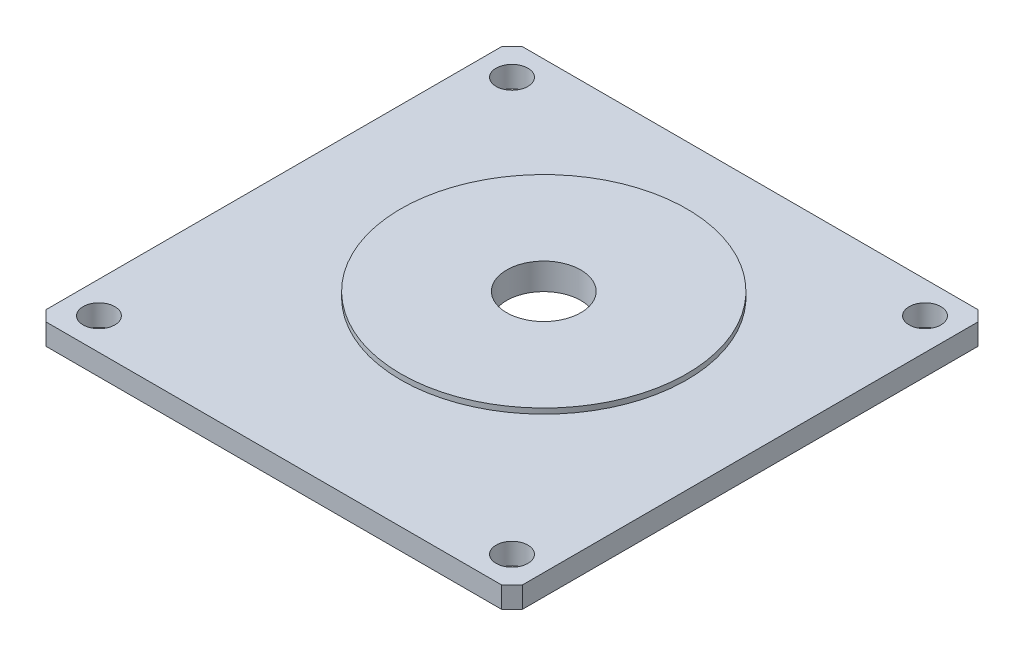
ISO-10303-21;
HEADER;
FILE_DESCRIPTION(('STEP AP214'),'2;1');
FILE_NAME('part.step','',(''),(''),'','','');
FILE_SCHEMA(('AUTOMOTIVE_DESIGN { 1 0 10303 214 1 1 1 1 }'));
ENDSEC;
DATA;
#1=APPLICATION_CONTEXT('core data for automotive mechanical design processes');
#2=APPLICATION_PROTOCOL_DEFINITION('international standard','automotive_design',2000,#1);
#3=PRODUCT_CONTEXT('',#1,'mechanical');
#4=PRODUCT('Part','Part','',(#3));
#5=PRODUCT_RELATED_PRODUCT_CATEGORY('part','',(#4));
#6=PRODUCT_DEFINITION_FORMATION('','',#4);
#7=PRODUCT_DEFINITION_CONTEXT('part definition',#1,'design');
#8=PRODUCT_DEFINITION('design','',#6,#7);
#9=PRODUCT_DEFINITION_SHAPE('','',#8);
#10=(LENGTH_UNIT() NAMED_UNIT(*) SI_UNIT(.MILLI.,.METRE.));
#11=(NAMED_UNIT(*) PLANE_ANGLE_UNIT() SI_UNIT($,.RADIAN.));
#12=(NAMED_UNIT(*) SI_UNIT($,.STERADIAN.) SOLID_ANGLE_UNIT());
#13=UNCERTAINTY_MEASURE_WITH_UNIT(LENGTH_MEASURE(1.E-05),#10,'distance_accuracy_value','');
#14=(GEOMETRIC_REPRESENTATION_CONTEXT(3) GLOBAL_UNCERTAINTY_ASSIGNED_CONTEXT((#13)) GLOBAL_UNIT_ASSIGNED_CONTEXT((#10,
#11,#12)) REPRESENTATION_CONTEXT('',''));
#15=CARTESIAN_POINT('',(0.,0.,0.));
#16=DIRECTION('',(0.,0.,1.));
#17=DIRECTION('',(1.,0.,0.));
#18=AXIS2_PLACEMENT_3D('',#15,#16,#17);
#19=CARTESIAN_POINT('',(22.5,2.,22.5));
#20=DIRECTION('',(-1.,0.,0.));
#21=DIRECTION('',(0.,0.,1.));
#22=AXIS2_PLACEMENT_3D('',#19,#20,#21);
#23=PLANE('',#22);
#24=DIRECTION('',(0.,0.,-1.));
#25=VECTOR('',#24,1.);
#26=CARTESIAN_POINT('',(22.5,2.,22.5));
#27=LINE('',#26,#25);
#28=CARTESIAN_POINT('',(22.5,2.,21.5));
#29=VERTEX_POINT('',#28);
#30=CARTESIAN_POINT('',(22.5,2.,-21.5));
#31=VERTEX_POINT('',#30);
#32=EDGE_CURVE('E127',#29,#31,#27,.T.);
#33=ORIENTED_EDGE('',*,*,#32,.F.);
#34=DIRECTION('',(0.,-1.,0.));
#35=VECTOR('',#34,1.);
#36=CARTESIAN_POINT('',(22.5,2.,21.5));
#37=LINE('',#36,#35);
#38=CARTESIAN_POINT('',(22.5,0.,21.5));
#39=VERTEX_POINT('',#38);
#40=EDGE_CURVE('E154',#29,#39,#37,.T.);
#41=ORIENTED_EDGE('',*,*,#40,.T.);
#42=DIRECTION('',(0.,0.,-1.));
#43=VECTOR('',#42,1.);
#44=CARTESIAN_POINT('',(22.5,0.,22.5));
#45=LINE('',#44,#43);
#46=CARTESIAN_POINT('',(22.5,0.,-21.5));
#47=VERTEX_POINT('',#46);
#48=EDGE_CURVE('E162',#39,#47,#45,.T.);
#49=ORIENTED_EDGE('',*,*,#48,.T.);
#50=DIRECTION('',(0.,1.,0.));
#51=VECTOR('',#50,1.);
#52=CARTESIAN_POINT('',(22.5,2.,-21.5));
#53=LINE('',#52,#51);
#54=EDGE_CURVE('E152',#47,#31,#53,.T.);
#55=ORIENTED_EDGE('',*,*,#54,.T.);
#56=EDGE_LOOP('',(#33,#41,#49,#55));
#57=FACE_BOUND('',#56,.T.);
#58=ADVANCED_FACE('F36',(#57),#23,.F.);
#59=CARTESIAN_POINT('',(-22.5,2.,-22.5));
#60=DIRECTION('',(0.,0.,1.));
#61=DIRECTION('',(1.,0.,0.));
#62=AXIS2_PLACEMENT_3D('',#59,#60,#61);
#63=PLANE('',#62);
#64=DIRECTION('',(-1.,0.,0.));
#65=VECTOR('',#64,1.);
#66=CARTESIAN_POINT('',(-22.5,0.,-22.5));
#67=LINE('',#66,#65);
#68=CARTESIAN_POINT('',(21.5,0.,-22.5));
#69=VERTEX_POINT('',#68);
#70=CARTESIAN_POINT('',(-21.5,0.,-22.5));
#71=VERTEX_POINT('',#70);
#72=EDGE_CURVE('E132',#69,#71,#67,.T.);
#73=ORIENTED_EDGE('',*,*,#72,.T.);
#74=DIRECTION('',(0.,1.,0.));
#75=VECTOR('',#74,1.);
#76=CARTESIAN_POINT('',(-21.5,2.,-22.5));
#77=LINE('',#76,#75);
#78=CARTESIAN_POINT('',(-21.5,2.,-22.5));
#79=VERTEX_POINT('',#78);
#80=EDGE_CURVE('E11',#71,#79,#77,.T.);
#81=ORIENTED_EDGE('',*,*,#80,.T.);
#82=DIRECTION('',(-1.,0.,0.));
#83=VECTOR('',#82,1.);
#84=CARTESIAN_POINT('',(-22.5,2.,-22.5));
#85=LINE('',#84,#83);
#86=CARTESIAN_POINT('',(21.5,2.,-22.5));
#87=VERTEX_POINT('',#86);
#88=EDGE_CURVE('E130',#87,#79,#85,.T.);
#89=ORIENTED_EDGE('',*,*,#88,.F.);
#90=DIRECTION('',(0.,-1.,0.));
#91=VECTOR('',#90,1.);
#92=CARTESIAN_POINT('',(21.5,2.,-22.5));
#93=LINE('',#92,#91);
#94=EDGE_CURVE('E44',#87,#69,#93,.T.);
#95=ORIENTED_EDGE('',*,*,#94,.T.);
#96=EDGE_LOOP('',(#73,#81,#89,#95));
#97=FACE_BOUND('',#96,.T.);
#98=ADVANCED_FACE('F159',(#97),#63,.F.);
#99=CARTESIAN_POINT('',(-22.5,2.,22.5));
#100=DIRECTION('',(1.,0.,0.));
#101=DIRECTION('',(0.,0.,-1.));
#102=AXIS2_PLACEMENT_3D('',#99,#100,#101);
#103=PLANE('',#102);
#104=DIRECTION('',(0.,0.,1.));
#105=VECTOR('',#104,1.);
#106=CARTESIAN_POINT('',(-22.5,0.,22.5));
#107=LINE('',#106,#105);
#108=CARTESIAN_POINT('',(-22.5,0.,-21.5));
#109=VERTEX_POINT('',#108);
#110=CARTESIAN_POINT('',(-22.5,0.,21.5));
#111=VERTEX_POINT('',#110);
#112=EDGE_CURVE('E128',#109,#111,#107,.T.);
#113=ORIENTED_EDGE('',*,*,#112,.T.);
#114=DIRECTION('',(0.,1.,0.));
#115=VECTOR('',#114,1.);
#116=CARTESIAN_POINT('',(-22.5,2.,21.5));
#117=LINE('',#116,#115);
#118=CARTESIAN_POINT('',(-22.5,2.,21.5));
#119=VERTEX_POINT('',#118);
#120=EDGE_CURVE('E106',#111,#119,#117,.T.);
#121=ORIENTED_EDGE('',*,*,#120,.T.);
#122=DIRECTION('',(0.,0.,1.));
#123=VECTOR('',#122,1.);
#124=CARTESIAN_POINT('',(-22.5,2.,22.5));
#125=LINE('',#124,#123);
#126=CARTESIAN_POINT('',(-22.5,2.,-21.5));
#127=VERTEX_POINT('',#126);
#128=EDGE_CURVE('E167',#127,#119,#125,.T.);
#129=ORIENTED_EDGE('',*,*,#128,.F.);
#130=DIRECTION('',(0.,-1.,0.));
#131=VECTOR('',#130,1.);
#132=CARTESIAN_POINT('',(-22.5,2.,-21.5));
#133=LINE('',#132,#131);
#134=EDGE_CURVE('E111',#127,#109,#133,.T.);
#135=ORIENTED_EDGE('',*,*,#134,.T.);
#136=EDGE_LOOP('',(#113,#121,#129,#135));
#137=FACE_BOUND('',#136,.T.);
#138=ADVANCED_FACE('F228',(#137),#103,.F.);
#139=CARTESIAN_POINT('',(-22.5,2.,22.5));
#140=DIRECTION('',(0.,0.,-1.));
#141=DIRECTION('',(-1.,0.,0.));
#142=AXIS2_PLACEMENT_3D('',#139,#140,#141);
#143=PLANE('',#142);
#144=DIRECTION('',(1.,0.,0.));
#145=VECTOR('',#144,1.);
#146=CARTESIAN_POINT('',(-22.5,2.,22.5));
#147=LINE('',#146,#145);
#148=CARTESIAN_POINT('',(-21.5,2.,22.5));
#149=VERTEX_POINT('',#148);
#150=CARTESIAN_POINT('',(21.5,2.,22.5));
#151=VERTEX_POINT('',#150);
#152=EDGE_CURVE('E121',#149,#151,#147,.T.);
#153=ORIENTED_EDGE('',*,*,#152,.F.);
#154=DIRECTION('',(0.,-1.,0.));
#155=VECTOR('',#154,1.);
#156=CARTESIAN_POINT('',(-21.5,2.,22.5));
#157=LINE('',#156,#155);
#158=CARTESIAN_POINT('',(-21.5,0.,22.5));
#159=VERTEX_POINT('',#158);
#160=EDGE_CURVE('E105',#149,#159,#157,.T.);
#161=ORIENTED_EDGE('',*,*,#160,.T.);
#162=DIRECTION('',(1.,0.,0.));
#163=VECTOR('',#162,1.);
#164=CARTESIAN_POINT('',(-22.5,0.,22.5));
#165=LINE('',#164,#163);
#166=CARTESIAN_POINT('',(21.5,0.,22.5));
#167=VERTEX_POINT('',#166);
#168=EDGE_CURVE('E118',#159,#167,#165,.T.);
#169=ORIENTED_EDGE('',*,*,#168,.T.);
#170=DIRECTION('',(0.,1.,0.));
#171=VECTOR('',#170,1.);
#172=CARTESIAN_POINT('',(21.5,2.,22.5));
#173=LINE('',#172,#171);
#174=EDGE_CURVE('E123',#167,#151,#173,.T.);
#175=ORIENTED_EDGE('',*,*,#174,.T.);
#176=EDGE_LOOP('',(#153,#161,#169,#175));
#177=FACE_BOUND('',#176,.T.);
#178=ADVANCED_FACE('F117',(#177),#143,.F.);
#179=CARTESIAN_POINT('',(0.,2.,0.));
#180=DIRECTION('',(0.,-1.,0.));
#181=DIRECTION('',(0.,0.,-1.));
#182=AXIS2_PLACEMENT_3D('',#179,#180,#181);
#183=PLANE('',#182);
#184=CARTESIAN_POINT('',(19.5,2.,19.5));
#185=DIRECTION('',(0.,-1.,0.));
#186=DIRECTION('',(0.,0.,-1.));
#187=AXIS2_PLACEMENT_3D('',#184,#185,#186);
#188=CIRCLE('',#187,1.5);
#189=CARTESIAN_POINT('',(19.5,2.,18.));
#190=VERTEX_POINT('',#189);
#191=EDGE_CURVE('E181',#190,#190,#188,.F.);
#192=ORIENTED_EDGE('',*,*,#191,.F.);
#193=EDGE_LOOP('',(#192));
#194=FACE_BOUND('',#193,.T.);
#195=CARTESIAN_POINT('',(-19.5,2.,19.5));
#196=DIRECTION('',(0.,-1.,0.));
#197=DIRECTION('',(0.,0.,-1.));
#198=AXIS2_PLACEMENT_3D('',#195,#196,#197);
#199=CIRCLE('',#198,1.5);
#200=CARTESIAN_POINT('',(-19.5,2.,18.));
#201=VERTEX_POINT('',#200);
#202=EDGE_CURVE('E184',#201,#201,#199,.F.);
#203=ORIENTED_EDGE('',*,*,#202,.F.);
#204=EDGE_LOOP('',(#203));
#205=FACE_BOUND('',#204,.T.);
#206=CARTESIAN_POINT('',(-19.5,2.,-19.5));
#207=DIRECTION('',(0.,-1.,0.));
#208=DIRECTION('',(0.,0.,-1.));
#209=AXIS2_PLACEMENT_3D('',#206,#207,#208);
#210=CIRCLE('',#209,1.5);
#211=CARTESIAN_POINT('',(-19.5,2.,-21.));
#212=VERTEX_POINT('',#211);
#213=EDGE_CURVE('E187',#212,#212,#210,.F.);
#214=ORIENTED_EDGE('',*,*,#213,.F.);
#215=EDGE_LOOP('',(#214));
#216=FACE_BOUND('',#215,.T.);
#217=CARTESIAN_POINT('',(19.5,2.,-19.5));
#218=DIRECTION('',(0.,-1.,0.));
#219=DIRECTION('',(0.,0.,-1.));
#220=AXIS2_PLACEMENT_3D('',#217,#218,#219);
#221=CIRCLE('',#220,1.5);
#222=CARTESIAN_POINT('',(19.5,2.,-21.));
#223=VERTEX_POINT('',#222);
#224=EDGE_CURVE('E190',#223,#223,#221,.F.);
#225=ORIENTED_EDGE('',*,*,#224,.F.);
#226=EDGE_LOOP('',(#225));
#227=FACE_BOUND('',#226,.T.);
#228=CARTESIAN_POINT('',(0.,2.,-3.));
#229=DIRECTION('',(0.,1.,0.));
#230=DIRECTION('',(0.,0.,1.));
#231=AXIS2_PLACEMENT_3D('',#228,#229,#230);
#232=CIRCLE('',#231,13.5);
#233=CARTESIAN_POINT('',(0.,2.,10.5));
#234=VERTEX_POINT('',#233);
#235=EDGE_CURVE('E136',#234,#234,#232,.T.);
#236=ORIENTED_EDGE('',*,*,#235,.F.);
#237=EDGE_LOOP('',(#236));
#238=FACE_BOUND('',#237,.T.);
#239=ORIENTED_EDGE('',*,*,#128,.T.);
#240=DIRECTION('',(-0.707106781186545,0.,-0.70710678118655));
#241=VECTOR('',#240,1.);
#242=CARTESIAN_POINT('',(-21.5,2.,22.5));
#243=LINE('',#242,#241);
#244=EDGE_CURVE('E150',#119,#149,#243,.F.);
#245=ORIENTED_EDGE('',*,*,#244,.T.);
#246=ORIENTED_EDGE('',*,*,#152,.T.);
#247=DIRECTION('',(-0.70710678118655,0.,0.707106781186545));
#248=VECTOR('',#247,1.);
#249=CARTESIAN_POINT('',(22.5,2.,21.5));
#250=LINE('',#249,#248);
#251=EDGE_CURVE('E148',#151,#29,#250,.F.);
#252=ORIENTED_EDGE('',*,*,#251,.T.);
#253=ORIENTED_EDGE('',*,*,#32,.T.);
#254=DIRECTION('',(0.707106781186548,0.,0.707106781186548));
#255=VECTOR('',#254,1.);
#256=CARTESIAN_POINT('',(21.5,2.,-22.5));
#257=LINE('',#256,#255);
#258=EDGE_CURVE('E56',#31,#87,#257,.F.);
#259=ORIENTED_EDGE('',*,*,#258,.T.);
#260=ORIENTED_EDGE('',*,*,#88,.T.);
#261=DIRECTION('',(0.70710678118655,0.,-0.707106781186545));
#262=VECTOR('',#261,1.);
#263=CARTESIAN_POINT('',(-22.5,2.,-21.5));
#264=LINE('',#263,#262);
#265=EDGE_CURVE('E146',#79,#127,#264,.F.);
#266=ORIENTED_EDGE('',*,*,#265,.T.);
#267=EDGE_LOOP('',(#239,#245,#246,#252,#253,#259,#260,#266));
#268=FACE_BOUND('',#267,.T.);
#269=ADVANCED_FACE('F216',(#194,#205,#216,#227,#238,#268),#183,.F.);
#270=CARTESIAN_POINT('',(0.,0.,0.));
#271=DIRECTION('',(0.,-1.,0.));
#272=DIRECTION('',(0.,0.,-1.));
#273=AXIS2_PLACEMENT_3D('',#270,#271,#272);
#274=PLANE('',#273);
#275=CARTESIAN_POINT('',(19.5,0.,19.5));
#276=DIRECTION('',(0.,1.,0.));
#277=DIRECTION('',(0.,0.,-1.));
#278=AXIS2_PLACEMENT_3D('',#275,#276,#277);
#279=CIRCLE('',#278,1.5);
#280=CARTESIAN_POINT('',(19.5,0.,18.));
#281=VERTEX_POINT('',#280);
#282=EDGE_CURVE('E197',#281,#281,#279,.T.);
#283=ORIENTED_EDGE('',*,*,#282,.T.);
#284=EDGE_LOOP('',(#283));
#285=FACE_BOUND('',#284,.T.);
#286=CARTESIAN_POINT('',(-19.5,0.,19.5));
#287=DIRECTION('',(0.,1.,0.));
#288=DIRECTION('',(0.,0.,1.));
#289=AXIS2_PLACEMENT_3D('',#286,#287,#288);
#290=CIRCLE('',#289,1.5);
#291=CARTESIAN_POINT('',(-19.5,0.,21.));
#292=VERTEX_POINT('',#291);
#293=EDGE_CURVE('E200',#292,#292,#290,.T.);
#294=ORIENTED_EDGE('',*,*,#293,.T.);
#295=EDGE_LOOP('',(#294));
#296=FACE_BOUND('',#295,.T.);
#297=CARTESIAN_POINT('',(-19.5,0.,-19.5));
#298=DIRECTION('',(0.,1.,0.));
#299=DIRECTION('',(0.,0.,-1.));
#300=AXIS2_PLACEMENT_3D('',#297,#298,#299);
#301=CIRCLE('',#300,1.5);
#302=CARTESIAN_POINT('',(-19.5,0.,-21.));
#303=VERTEX_POINT('',#302);
#304=EDGE_CURVE('E196',#303,#303,#301,.T.);
#305=ORIENTED_EDGE('',*,*,#304,.T.);
#306=EDGE_LOOP('',(#305));
#307=FACE_BOUND('',#306,.T.);
#308=CARTESIAN_POINT('',(19.5,0.,-19.5));
#309=DIRECTION('',(0.,1.,0.));
#310=DIRECTION('',(0.,0.,1.));
#311=AXIS2_PLACEMENT_3D('',#308,#309,#310);
#312=CIRCLE('',#311,1.5);
#313=CARTESIAN_POINT('',(19.5,0.,-18.));
#314=VERTEX_POINT('',#313);
#315=EDGE_CURVE('E193',#314,#314,#312,.T.);
#316=ORIENTED_EDGE('',*,*,#315,.T.);
#317=EDGE_LOOP('',(#316));
#318=FACE_BOUND('',#317,.T.);
#319=CARTESIAN_POINT('',(0.,0.,-3.));
#320=DIRECTION('',(0.,1.,0.));
#321=DIRECTION('',(0.,0.,1.));
#322=AXIS2_PLACEMENT_3D('',#319,#320,#321);
#323=CIRCLE('',#322,3.5);
#324=CARTESIAN_POINT('',(0.,0.,0.5));
#325=VERTEX_POINT('',#324);
#326=EDGE_CURVE('E163',#325,#325,#323,.T.);
#327=ORIENTED_EDGE('',*,*,#326,.T.);
#328=EDGE_LOOP('',(#327));
#329=FACE_BOUND('',#328,.T.);
#330=ORIENTED_EDGE('',*,*,#168,.F.);
#331=DIRECTION('',(0.707106781186545,0.,0.70710678118655));
#332=VECTOR('',#331,1.);
#333=CARTESIAN_POINT('',(-22.0000000000001,0.,21.9999999999999));
#334=LINE('',#333,#332);
#335=EDGE_CURVE('E101',#159,#111,#334,.F.);
#336=ORIENTED_EDGE('',*,*,#335,.T.);
#337=ORIENTED_EDGE('',*,*,#112,.F.);
#338=DIRECTION('',(-0.70710678118655,0.,0.707106781186545));
#339=VECTOR('',#338,1.);
#340=CARTESIAN_POINT('',(-21.9999999999999,0.,-22.0000000000001));
#341=LINE('',#340,#339);
#342=EDGE_CURVE('E139',#109,#71,#341,.F.);
#343=ORIENTED_EDGE('',*,*,#342,.T.);
#344=ORIENTED_EDGE('',*,*,#72,.F.);
#345=DIRECTION('',(-0.707106781186548,0.,-0.707106781186548));
#346=VECTOR('',#345,1.);
#347=CARTESIAN_POINT('',(22.,0.,-22.));
#348=LINE('',#347,#346);
#349=EDGE_CURVE('E122',#69,#47,#348,.F.);
#350=ORIENTED_EDGE('',*,*,#349,.T.);
#351=ORIENTED_EDGE('',*,*,#48,.F.);
#352=DIRECTION('',(0.70710678118655,0.,-0.707106781186545));
#353=VECTOR('',#352,1.);
#354=CARTESIAN_POINT('',(21.9999999999999,0.,22.0000000000001));
#355=LINE('',#354,#353);
#356=EDGE_CURVE('E112',#39,#167,#355,.F.);
#357=ORIENTED_EDGE('',*,*,#356,.T.);
#358=EDGE_LOOP('',(#330,#336,#337,#343,#344,#350,#351,#357));
#359=FACE_BOUND('',#358,.T.);
#360=ADVANCED_FACE('F125',(#285,#296,#307,#318,#329,#359),#274,.T.);
#361=CARTESIAN_POINT('',(0.,0.,-3.));
#362=DIRECTION('',(0.,1.,0.));
#363=DIRECTION('',(0.,0.,1.));
#364=AXIS2_PLACEMENT_3D('',#361,#362,#363);
#365=CYLINDRICAL_SURFACE('',#364,3.5);
#366=ORIENTED_EDGE('',*,*,#326,.F.);
#367=EDGE_LOOP('',(#366));
#368=FACE_BOUND('',#367,.T.);
#369=CARTESIAN_POINT('',(0.,2.5,-3.));
#370=DIRECTION('',(0.,1.,0.));
#371=DIRECTION('',(0.,0.,1.));
#372=AXIS2_PLACEMENT_3D('',#369,#370,#371);
#373=CIRCLE('',#372,3.5);
#374=CARTESIAN_POINT('',(0.,2.5,0.5));
#375=VERTEX_POINT('',#374);
#376=EDGE_CURVE('E178',#375,#375,#373,.T.);
#377=ORIENTED_EDGE('',*,*,#376,.T.);
#378=EDGE_LOOP('',(#377));
#379=FACE_BOUND('',#378,.T.);
#380=ADVANCED_FACE('F271',(#368,#379),#365,.F.);
#381=CARTESIAN_POINT('',(0.,2.5,-3.));
#382=DIRECTION('',(0.,1.,0.));
#383=DIRECTION('',(0.,0.,1.));
#384=AXIS2_PLACEMENT_3D('',#381,#382,#383);
#385=PLANE('',#384);
#386=CARTESIAN_POINT('',(0.,2.5,-3.));
#387=DIRECTION('',(0.,1.,0.));
#388=DIRECTION('',(0.,0.,1.));
#389=AXIS2_PLACEMENT_3D('',#386,#387,#388);
#390=CIRCLE('',#389,13.5);
#391=CARTESIAN_POINT('',(0.,2.5,10.5));
#392=VERTEX_POINT('',#391);
#393=EDGE_CURVE('E173',#392,#392,#390,.T.);
#394=ORIENTED_EDGE('',*,*,#393,.T.);
#395=EDGE_LOOP('',(#394));
#396=FACE_BOUND('',#395,.T.);
#397=ORIENTED_EDGE('',*,*,#376,.F.);
#398=EDGE_LOOP('',(#397));
#399=FACE_BOUND('',#398,.T.);
#400=ADVANCED_FACE('F268',(#396,#399),#385,.T.);
#401=CARTESIAN_POINT('',(0.,2.5,-3.));
#402=DIRECTION('',(0.,-1.,0.));
#403=DIRECTION('',(0.,0.,-1.));
#404=AXIS2_PLACEMENT_3D('',#401,#402,#403);
#405=CYLINDRICAL_SURFACE('',#404,13.5);
#406=ORIENTED_EDGE('',*,*,#393,.F.);
#407=EDGE_LOOP('',(#406));
#408=FACE_BOUND('',#407,.T.);
#409=ORIENTED_EDGE('',*,*,#235,.T.);
#410=EDGE_LOOP('',(#409));
#411=FACE_BOUND('',#410,.T.);
#412=ADVANCED_FACE('F266',(#408,#411),#405,.T.);
#413=CARTESIAN_POINT('',(19.5,2.5,-19.5));
#414=DIRECTION('',(0.,-1.,0.));
#415=DIRECTION('',(0.,0.,-1.));
#416=AXIS2_PLACEMENT_3D('',#413,#414,#415);
#417=CYLINDRICAL_SURFACE('',#416,1.5);
#418=ORIENTED_EDGE('',*,*,#315,.F.);
#419=EDGE_LOOP('',(#418));
#420=FACE_BOUND('',#419,.T.);
#421=ORIENTED_EDGE('',*,*,#224,.T.);
#422=EDGE_LOOP('',(#421));
#423=FACE_BOUND('',#422,.T.);
#424=ADVANCED_FACE('F212',(#420,#423),#417,.F.);
#425=CARTESIAN_POINT('',(-19.5,2.5,-19.5));
#426=DIRECTION('',(0.,-1.,0.));
#427=DIRECTION('',(0.,0.,-1.));
#428=AXIS2_PLACEMENT_3D('',#425,#426,#427);
#429=CYLINDRICAL_SURFACE('',#428,1.5);
#430=ORIENTED_EDGE('',*,*,#304,.F.);
#431=EDGE_LOOP('',(#430));
#432=FACE_BOUND('',#431,.T.);
#433=ORIENTED_EDGE('',*,*,#213,.T.);
#434=EDGE_LOOP('',(#433));
#435=FACE_BOUND('',#434,.T.);
#436=ADVANCED_FACE('F208',(#432,#435),#429,.F.);
#437=CARTESIAN_POINT('',(-19.5,2.5,19.5));
#438=DIRECTION('',(0.,-1.,0.));
#439=DIRECTION('',(0.,0.,-1.));
#440=AXIS2_PLACEMENT_3D('',#437,#438,#439);
#441=CYLINDRICAL_SURFACE('',#440,1.5);
#442=ORIENTED_EDGE('',*,*,#293,.F.);
#443=EDGE_LOOP('',(#442));
#444=FACE_BOUND('',#443,.T.);
#445=ORIENTED_EDGE('',*,*,#202,.T.);
#446=EDGE_LOOP('',(#445));
#447=FACE_BOUND('',#446,.T.);
#448=ADVANCED_FACE('F211',(#444,#447),#441,.F.);
#449=CARTESIAN_POINT('',(19.5,2.5,19.5));
#450=DIRECTION('',(0.,-1.,0.));
#451=DIRECTION('',(0.,0.,-1.));
#452=AXIS2_PLACEMENT_3D('',#449,#450,#451);
#453=CYLINDRICAL_SURFACE('',#452,1.5);
#454=ORIENTED_EDGE('',*,*,#282,.F.);
#455=EDGE_LOOP('',(#454));
#456=FACE_BOUND('',#455,.T.);
#457=ORIENTED_EDGE('',*,*,#191,.T.);
#458=EDGE_LOOP('',(#457));
#459=FACE_BOUND('',#458,.T.);
#460=ADVANCED_FACE('F250',(#456,#459),#453,.F.);
#461=CARTESIAN_POINT('',(-21.5,2.,22.5));
#462=DIRECTION('',(0.70710678118655,0.,-0.707106781186545));
#463=DIRECTION('',(0.,-1.,0.));
#464=AXIS2_PLACEMENT_3D('',#461,#462,#463);
#465=PLANE('',#464);
#466=ORIENTED_EDGE('',*,*,#244,.F.);
#467=ORIENTED_EDGE('',*,*,#120,.F.);
#468=ORIENTED_EDGE('',*,*,#335,.F.);
#469=ORIENTED_EDGE('',*,*,#160,.F.);
#470=EDGE_LOOP('',(#466,#467,#468,#469));
#471=FACE_BOUND('',#470,.T.);
#472=ADVANCED_FACE('F104',(#471),#465,.F.);
#473=CARTESIAN_POINT('',(22.5,2.,21.5));
#474=DIRECTION('',(-0.707106781186545,0.,-0.70710678118655));
#475=DIRECTION('',(0.,-1.,0.));
#476=AXIS2_PLACEMENT_3D('',#473,#474,#475);
#477=PLANE('',#476);
#478=ORIENTED_EDGE('',*,*,#251,.F.);
#479=ORIENTED_EDGE('',*,*,#174,.F.);
#480=ORIENTED_EDGE('',*,*,#356,.F.);
#481=ORIENTED_EDGE('',*,*,#40,.F.);
#482=EDGE_LOOP('',(#478,#479,#480,#481));
#483=FACE_BOUND('',#482,.T.);
#484=ADVANCED_FACE('F232',(#483),#477,.F.);
#485=CARTESIAN_POINT('',(-22.5,2.,-21.5));
#486=DIRECTION('',(0.707106781186545,0.,0.70710678118655));
#487=DIRECTION('',(0.,-1.,0.));
#488=AXIS2_PLACEMENT_3D('',#485,#486,#487);
#489=PLANE('',#488);
#490=ORIENTED_EDGE('',*,*,#265,.F.);
#491=ORIENTED_EDGE('',*,*,#80,.F.);
#492=ORIENTED_EDGE('',*,*,#342,.F.);
#493=ORIENTED_EDGE('',*,*,#134,.F.);
#494=EDGE_LOOP('',(#490,#491,#492,#493));
#495=FACE_BOUND('',#494,.T.);
#496=ADVANCED_FACE('F230',(#495),#489,.F.);
#497=CARTESIAN_POINT('',(21.5,2.,-22.5));
#498=DIRECTION('',(-0.707106781186547,0.,0.707106781186547));
#499=DIRECTION('',(0.,-1.,0.));
#500=AXIS2_PLACEMENT_3D('',#497,#498,#499);
#501=PLANE('',#500);
#502=ORIENTED_EDGE('',*,*,#258,.F.);
#503=ORIENTED_EDGE('',*,*,#54,.F.);
#504=ORIENTED_EDGE('',*,*,#349,.F.);
#505=ORIENTED_EDGE('',*,*,#94,.F.);
#506=EDGE_LOOP('',(#502,#503,#504,#505));
#507=FACE_BOUND('',#506,.T.);
#508=ADVANCED_FACE('F38',(#507),#501,.F.);
#509=CLOSED_SHELL('',(#58,#98,#138,#178,#269,#360,#380,#400,#412,#424,#436,#448,#460,#472,#484,
#496,#508));
#510=MANIFOLD_SOLID_BREP('B2',#509);
#511=ADVANCED_BREP_SHAPE_REPRESENTATION('',(#18,#510),#14);
#512=SHAPE_DEFINITION_REPRESENTATION(#9,#511);
ENDSEC;
END-ISO-10303-21;
